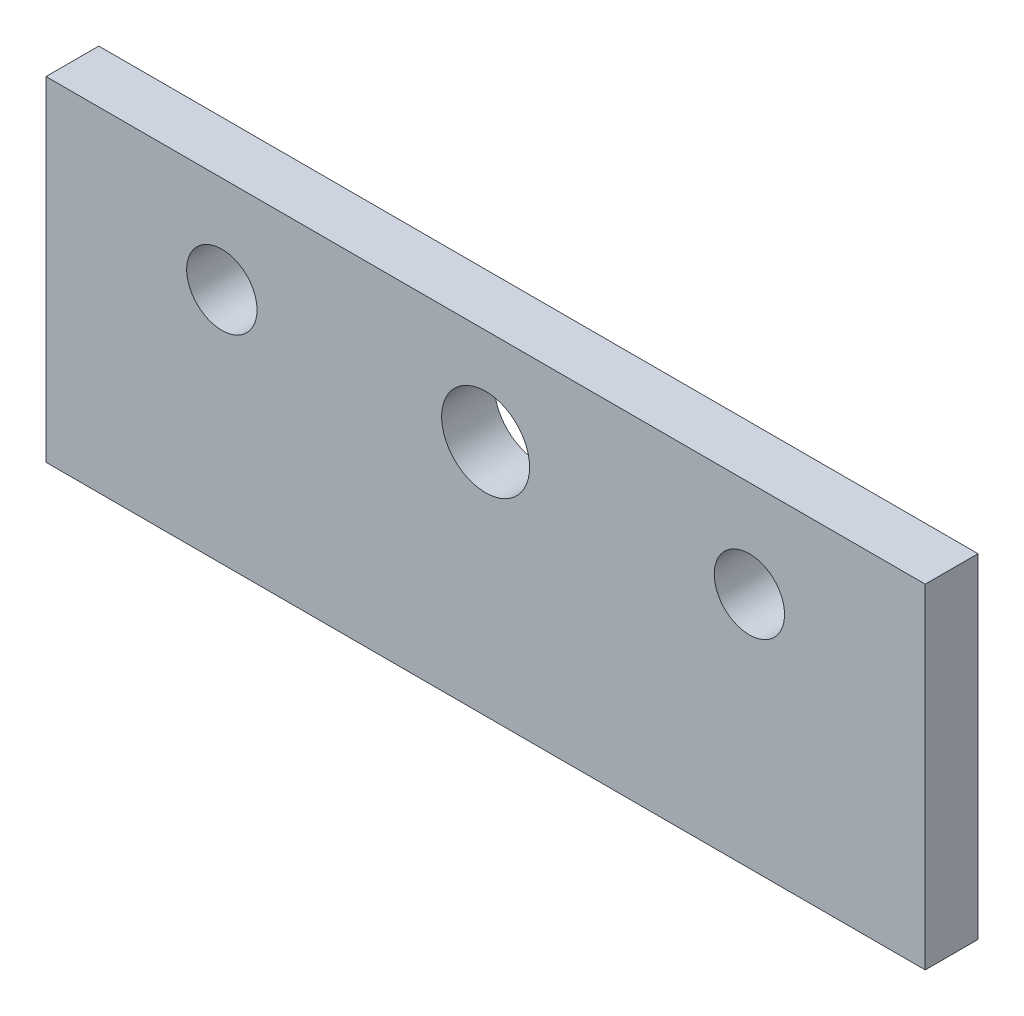
ISO-10303-21;
HEADER;
FILE_DESCRIPTION(('STEP AP214'),'2;1');
FILE_NAME('part.step','',(''),(''),'','','');
FILE_SCHEMA(('AUTOMOTIVE_DESIGN { 1 0 10303 214 1 1 1 1 }'));
ENDSEC;
DATA;
#1=APPLICATION_CONTEXT('core data for automotive mechanical design processes');
#2=APPLICATION_PROTOCOL_DEFINITION('international standard','automotive_design',2000,#1);
#3=PRODUCT_CONTEXT('',#1,'mechanical');
#4=PRODUCT('Part','Part','',(#3));
#5=PRODUCT_RELATED_PRODUCT_CATEGORY('part','',(#4));
#6=PRODUCT_DEFINITION_FORMATION('','',#4);
#7=PRODUCT_DEFINITION_CONTEXT('part definition',#1,'design');
#8=PRODUCT_DEFINITION('design','',#6,#7);
#9=PRODUCT_DEFINITION_SHAPE('','',#8);
#10=(LENGTH_UNIT() NAMED_UNIT(*) SI_UNIT(.MILLI.,.METRE.));
#11=(NAMED_UNIT(*) PLANE_ANGLE_UNIT() SI_UNIT($,.RADIAN.));
#12=(NAMED_UNIT(*) SI_UNIT($,.STERADIAN.) SOLID_ANGLE_UNIT());
#13=UNCERTAINTY_MEASURE_WITH_UNIT(LENGTH_MEASURE(1.E-05),#10,'distance_accuracy_value','');
#14=(GEOMETRIC_REPRESENTATION_CONTEXT(3) GLOBAL_UNCERTAINTY_ASSIGNED_CONTEXT((#13)) GLOBAL_UNIT_ASSIGNED_CONTEXT((#10,
#11,#12)) REPRESENTATION_CONTEXT('',''));
#15=CARTESIAN_POINT('',(0.,0.,0.));
#16=DIRECTION('',(0.,0.,1.));
#17=DIRECTION('',(1.,0.,0.));
#18=AXIS2_PLACEMENT_3D('',#15,#16,#17);
#19=CARTESIAN_POINT('',(25.,9.5,-3.));
#20=DIRECTION('',(1.,0.,0.));
#21=DIRECTION('',(0.,1.,0.));
#22=AXIS2_PLACEMENT_3D('',#19,#20,#21);
#23=PLANE('',#22);
#24=DIRECTION('',(0.,1.,0.));
#25=VECTOR('',#24,1.);
#26=CARTESIAN_POINT('',(25.,9.5,0.));
#27=LINE('',#26,#25);
#28=CARTESIAN_POINT('',(25.,-9.5,0.));
#29=VERTEX_POINT('',#28);
#30=CARTESIAN_POINT('',(25.,9.5,0.));
#31=VERTEX_POINT('',#30);
#32=EDGE_CURVE('E102',#29,#31,#27,.T.);
#33=ORIENTED_EDGE('',*,*,#32,.F.);
#34=DIRECTION('',(0.,0.,1.));
#35=VECTOR('',#34,1.);
#36=CARTESIAN_POINT('',(25.,-9.5,-3.));
#37=LINE('',#36,#35);
#38=CARTESIAN_POINT('',(25.,-9.5,-3.));
#39=VERTEX_POINT('',#38);
#40=EDGE_CURVE('E11',#39,#29,#37,.T.);
#41=ORIENTED_EDGE('',*,*,#40,.F.);
#42=DIRECTION('',(0.,1.,0.));
#43=VECTOR('',#42,1.);
#44=CARTESIAN_POINT('',(25.,9.5,-3.));
#45=LINE('',#44,#43);
#46=CARTESIAN_POINT('',(25.,9.5,-3.));
#47=VERTEX_POINT('',#46);
#48=EDGE_CURVE('E95',#39,#47,#45,.T.);
#49=ORIENTED_EDGE('',*,*,#48,.T.);
#50=DIRECTION('',(0.,0.,1.));
#51=VECTOR('',#50,1.);
#52=CARTESIAN_POINT('',(25.,9.5,-3.));
#53=LINE('',#52,#51);
#54=EDGE_CURVE('E40',#47,#31,#53,.T.);
#55=ORIENTED_EDGE('',*,*,#54,.T.);
#56=EDGE_LOOP('',(#33,#41,#49,#55));
#57=FACE_BOUND('',#56,.T.);
#58=ADVANCED_FACE('F37',(#57),#23,.T.);
#59=CARTESIAN_POINT('',(-25.,-9.5,-3.));
#60=DIRECTION('',(0.,-1.,0.));
#61=DIRECTION('',(0.,0.,-1.));
#62=AXIS2_PLACEMENT_3D('',#59,#60,#61);
#63=PLANE('',#62);
#64=DIRECTION('',(1.,0.,0.));
#65=VECTOR('',#64,1.);
#66=CARTESIAN_POINT('',(-25.,-9.5,0.));
#67=LINE('',#66,#65);
#68=CARTESIAN_POINT('',(-25.,-9.5,0.));
#69=VERTEX_POINT('',#68);
#70=EDGE_CURVE('E97',#69,#29,#67,.T.);
#71=ORIENTED_EDGE('',*,*,#70,.F.);
#72=DIRECTION('',(0.,0.,1.));
#73=VECTOR('',#72,1.);
#74=CARTESIAN_POINT('',(-25.,-9.5,-3.));
#75=LINE('',#74,#73);
#76=CARTESIAN_POINT('',(-25.,-9.5,-3.));
#77=VERTEX_POINT('',#76);
#78=EDGE_CURVE('E46',#77,#69,#75,.T.);
#79=ORIENTED_EDGE('',*,*,#78,.F.);
#80=DIRECTION('',(1.,0.,0.));
#81=VECTOR('',#80,1.);
#82=CARTESIAN_POINT('',(-25.,-9.5,-3.));
#83=LINE('',#82,#81);
#84=EDGE_CURVE('E92',#77,#39,#83,.T.);
#85=ORIENTED_EDGE('',*,*,#84,.T.);
#86=ORIENTED_EDGE('',*,*,#40,.T.);
#87=EDGE_LOOP('',(#71,#79,#85,#86));
#88=FACE_BOUND('',#87,.T.);
#89=ADVANCED_FACE('F113',(#88),#63,.T.);
#90=CARTESIAN_POINT('',(-25.,9.5,-3.));
#91=DIRECTION('',(-1.,0.,0.));
#92=DIRECTION('',(0.,-1.,0.));
#93=AXIS2_PLACEMENT_3D('',#90,#91,#92);
#94=PLANE('',#93);
#95=DIRECTION('',(0.,-1.,0.));
#96=VECTOR('',#95,1.);
#97=CARTESIAN_POINT('',(-25.,9.5,0.));
#98=LINE('',#97,#96);
#99=CARTESIAN_POINT('',(-25.,9.5,0.));
#100=VERTEX_POINT('',#99);
#101=EDGE_CURVE('E87',#100,#69,#98,.T.);
#102=ORIENTED_EDGE('',*,*,#101,.F.);
#103=DIRECTION('',(0.,0.,1.));
#104=VECTOR('',#103,1.);
#105=CARTESIAN_POINT('',(-25.,9.5,-3.));
#106=LINE('',#105,#104);
#107=CARTESIAN_POINT('',(-25.,9.5,-3.));
#108=VERTEX_POINT('',#107);
#109=EDGE_CURVE('E82',#108,#100,#106,.T.);
#110=ORIENTED_EDGE('',*,*,#109,.F.);
#111=DIRECTION('',(0.,-1.,0.));
#112=VECTOR('',#111,1.);
#113=CARTESIAN_POINT('',(-25.,9.5,-3.));
#114=LINE('',#113,#112);
#115=EDGE_CURVE('E85',#108,#77,#114,.T.);
#116=ORIENTED_EDGE('',*,*,#115,.T.);
#117=ORIENTED_EDGE('',*,*,#78,.T.);
#118=EDGE_LOOP('',(#102,#110,#116,#117));
#119=FACE_BOUND('',#118,.T.);
#120=ADVANCED_FACE('F84',(#119),#94,.T.);
#121=CARTESIAN_POINT('',(-25.,9.5,-3.));
#122=DIRECTION('',(0.,1.,0.));
#123=DIRECTION('',(0.,0.,1.));
#124=AXIS2_PLACEMENT_3D('',#121,#122,#123);
#125=PLANE('',#124);
#126=DIRECTION('',(-1.,0.,0.));
#127=VECTOR('',#126,1.);
#128=CARTESIAN_POINT('',(-25.,9.5,0.));
#129=LINE('',#128,#127);
#130=EDGE_CURVE('E105',#31,#100,#129,.T.);
#131=ORIENTED_EDGE('',*,*,#130,.F.);
#132=ORIENTED_EDGE('',*,*,#54,.F.);
#133=DIRECTION('',(-1.,0.,0.));
#134=VECTOR('',#133,1.);
#135=CARTESIAN_POINT('',(-25.,9.5,-3.));
#136=LINE('',#135,#134);
#137=EDGE_CURVE('E91',#47,#108,#136,.T.);
#138=ORIENTED_EDGE('',*,*,#137,.T.);
#139=ORIENTED_EDGE('',*,*,#109,.T.);
#140=EDGE_LOOP('',(#131,#132,#138,#139));
#141=FACE_BOUND('',#140,.T.);
#142=ADVANCED_FACE('F94',(#141),#125,.T.);
#143=CARTESIAN_POINT('',(0.,0.,-3.));
#144=DIRECTION('',(0.,0.,1.));
#145=DIRECTION('',(1.,0.,0.));
#146=AXIS2_PLACEMENT_3D('',#143,#144,#145);
#147=PLANE('',#146);
#148=CARTESIAN_POINT('',(0.,4.,-3.));
#149=DIRECTION('',(0.,0.,1.));
#150=DIRECTION('',(1.,0.,0.));
#151=AXIS2_PLACEMENT_3D('',#148,#149,#150);
#152=CIRCLE('',#151,2.5);
#153=CARTESIAN_POINT('',(2.5,4.,-3.));
#154=VERTEX_POINT('',#153);
#155=EDGE_CURVE('E150',#154,#154,#152,.T.);
#156=ORIENTED_EDGE('',*,*,#155,.T.);
#157=EDGE_LOOP('',(#156));
#158=FACE_BOUND('',#157,.T.);
#159=CARTESIAN_POINT('',(15.,4.,-3.));
#160=DIRECTION('',(0.,0.,1.));
#161=DIRECTION('',(-1.,0.,0.));
#162=AXIS2_PLACEMENT_3D('',#159,#160,#161);
#163=CIRCLE('',#162,2.);
#164=CARTESIAN_POINT('',(13.,4.,-3.));
#165=VERTEX_POINT('',#164);
#166=EDGE_CURVE('E158',#165,#165,#163,.T.);
#167=ORIENTED_EDGE('',*,*,#166,.T.);
#168=EDGE_LOOP('',(#167));
#169=FACE_BOUND('',#168,.T.);
#170=CARTESIAN_POINT('',(-15.,4.,-3.));
#171=DIRECTION('',(0.,0.,1.));
#172=DIRECTION('',(1.,0.,0.));
#173=AXIS2_PLACEMENT_3D('',#170,#171,#172);
#174=CIRCLE('',#173,2.);
#175=CARTESIAN_POINT('',(-13.,4.,-3.));
#176=VERTEX_POINT('',#175);
#177=EDGE_CURVE('E106',#176,#176,#174,.T.);
#178=ORIENTED_EDGE('',*,*,#177,.T.);
#179=EDGE_LOOP('',(#178));
#180=FACE_BOUND('',#179,.T.);
#181=ORIENTED_EDGE('',*,*,#48,.F.);
#182=ORIENTED_EDGE('',*,*,#84,.F.);
#183=ORIENTED_EDGE('',*,*,#115,.F.);
#184=ORIENTED_EDGE('',*,*,#137,.F.);
#185=EDGE_LOOP('',(#181,#182,#183,#184));
#186=FACE_BOUND('',#185,.T.);
#187=ADVANCED_FACE('F90',(#158,#169,#180,#186),#147,.F.);
#188=CARTESIAN_POINT('',(0.,0.,0.));
#189=DIRECTION('',(0.,0.,1.));
#190=DIRECTION('',(1.,0.,0.));
#191=AXIS2_PLACEMENT_3D('',#188,#189,#190);
#192=PLANE('',#191);
#193=CARTESIAN_POINT('',(0.,4.,0.));
#194=DIRECTION('',(0.,0.,1.));
#195=DIRECTION('',(1.,0.,0.));
#196=AXIS2_PLACEMENT_3D('',#193,#194,#195);
#197=CIRCLE('',#196,2.5);
#198=CARTESIAN_POINT('',(2.5,4.,0.));
#199=VERTEX_POINT('',#198);
#200=EDGE_CURVE('E153',#199,#199,#197,.T.);
#201=ORIENTED_EDGE('',*,*,#200,.F.);
#202=EDGE_LOOP('',(#201));
#203=FACE_BOUND('',#202,.T.);
#204=CARTESIAN_POINT('',(15.,4.,0.));
#205=DIRECTION('',(0.,0.,1.));
#206=DIRECTION('',(-1.,0.,0.));
#207=AXIS2_PLACEMENT_3D('',#204,#205,#206);
#208=CIRCLE('',#207,2.);
#209=CARTESIAN_POINT('',(13.,4.,0.));
#210=VERTEX_POINT('',#209);
#211=EDGE_CURVE('E155',#210,#210,#208,.T.);
#212=ORIENTED_EDGE('',*,*,#211,.F.);
#213=EDGE_LOOP('',(#212));
#214=FACE_BOUND('',#213,.T.);
#215=CARTESIAN_POINT('',(-15.,4.,0.));
#216=DIRECTION('',(0.,0.,1.));
#217=DIRECTION('',(1.,0.,0.));
#218=AXIS2_PLACEMENT_3D('',#215,#216,#217);
#219=CIRCLE('',#218,2.);
#220=CARTESIAN_POINT('',(-13.,4.,0.));
#221=VERTEX_POINT('',#220);
#222=EDGE_CURVE('E161',#221,#221,#219,.T.);
#223=ORIENTED_EDGE('',*,*,#222,.F.);
#224=EDGE_LOOP('',(#223));
#225=FACE_BOUND('',#224,.T.);
#226=ORIENTED_EDGE('',*,*,#32,.T.);
#227=ORIENTED_EDGE('',*,*,#130,.T.);
#228=ORIENTED_EDGE('',*,*,#101,.T.);
#229=ORIENTED_EDGE('',*,*,#70,.T.);
#230=EDGE_LOOP('',(#226,#227,#228,#229));
#231=FACE_BOUND('',#230,.T.);
#232=ADVANCED_FACE('F112',(#203,#214,#225,#231),#192,.T.);
#233=CARTESIAN_POINT('',(-15.,4.,-3.));
#234=DIRECTION('',(0.,0.,1.));
#235=DIRECTION('',(1.,0.,0.));
#236=AXIS2_PLACEMENT_3D('',#233,#234,#235);
#237=CYLINDRICAL_SURFACE('',#236,2.);
#238=ORIENTED_EDGE('',*,*,#177,.F.);
#239=EDGE_LOOP('',(#238));
#240=FACE_BOUND('',#239,.T.);
#241=ORIENTED_EDGE('',*,*,#222,.T.);
#242=EDGE_LOOP('',(#241));
#243=FACE_BOUND('',#242,.T.);
#244=ADVANCED_FACE('F131',(#240,#243),#237,.F.);
#245=CARTESIAN_POINT('',(15.,4.,-3.));
#246=DIRECTION('',(0.,0.,1.));
#247=DIRECTION('',(1.,0.,0.));
#248=AXIS2_PLACEMENT_3D('',#245,#246,#247);
#249=CYLINDRICAL_SURFACE('',#248,2.);
#250=ORIENTED_EDGE('',*,*,#166,.F.);
#251=EDGE_LOOP('',(#250));
#252=FACE_BOUND('',#251,.T.);
#253=ORIENTED_EDGE('',*,*,#211,.T.);
#254=EDGE_LOOP('',(#253));
#255=FACE_BOUND('',#254,.T.);
#256=ADVANCED_FACE('F138',(#252,#255),#249,.F.);
#257=CARTESIAN_POINT('',(0.,4.,0.));
#258=DIRECTION('',(0.,0.,1.));
#259=DIRECTION('',(1.,0.,0.));
#260=AXIS2_PLACEMENT_3D('',#257,#258,#259);
#261=CYLINDRICAL_SURFACE('',#260,2.5);
#262=ORIENTED_EDGE('',*,*,#155,.F.);
#263=EDGE_LOOP('',(#262));
#264=FACE_BOUND('',#263,.T.);
#265=ORIENTED_EDGE('',*,*,#200,.T.);
#266=EDGE_LOOP('',(#265));
#267=FACE_BOUND('',#266,.T.);
#268=ADVANCED_FACE('F142',(#264,#267),#261,.F.);
#269=CLOSED_SHELL('',(#58,#89,#120,#142,#187,#232,#244,#256,#268));
#270=MANIFOLD_SOLID_BREP('B2',#269);
#271=ADVANCED_BREP_SHAPE_REPRESENTATION('',(#18,#270),#14);
#272=SHAPE_DEFINITION_REPRESENTATION(#9,#271);
ENDSEC;
END-ISO-10303-21;
